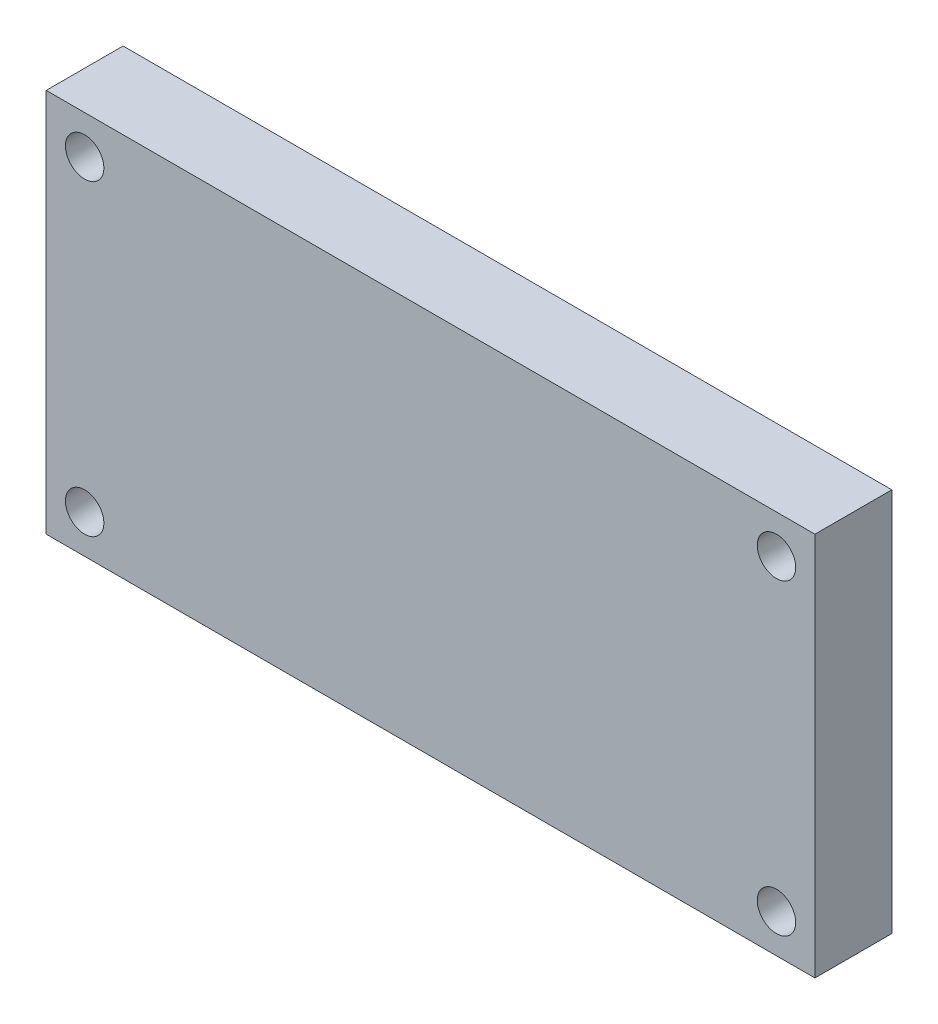
ISO-10303-21;
HEADER;
FILE_DESCRIPTION(('STEP AP214'),'2;1');
FILE_NAME('part.step','',(''),(''),'','','');
FILE_SCHEMA(('AUTOMOTIVE_DESIGN { 1 0 10303 214 1 1 1 1 }'));
ENDSEC;
DATA;
#1=APPLICATION_CONTEXT('core data for automotive mechanical design processes');
#2=APPLICATION_PROTOCOL_DEFINITION('international standard','automotive_design',2000,#1);
#3=PRODUCT_CONTEXT('',#1,'mechanical');
#4=PRODUCT('Part','Part','',(#3));
#5=PRODUCT_RELATED_PRODUCT_CATEGORY('part','',(#4));
#6=PRODUCT_DEFINITION_FORMATION('','',#4);
#7=PRODUCT_DEFINITION_CONTEXT('part definition',#1,'design');
#8=PRODUCT_DEFINITION('design','',#6,#7);
#9=PRODUCT_DEFINITION_SHAPE('','',#8);
#10=(LENGTH_UNIT() NAMED_UNIT(*) SI_UNIT(.MILLI.,.METRE.));
#11=(NAMED_UNIT(*) PLANE_ANGLE_UNIT() SI_UNIT($,.RADIAN.));
#12=(NAMED_UNIT(*) SI_UNIT($,.STERADIAN.) SOLID_ANGLE_UNIT());
#13=UNCERTAINTY_MEASURE_WITH_UNIT(LENGTH_MEASURE(1.E-05),#10,'distance_accuracy_value','');
#14=(GEOMETRIC_REPRESENTATION_CONTEXT(3) GLOBAL_UNCERTAINTY_ASSIGNED_CONTEXT((#13)) GLOBAL_UNIT_ASSIGNED_CONTEXT((#10,
#11,#12)) REPRESENTATION_CONTEXT('',''));
#15=CARTESIAN_POINT('',(0.,0.,0.));
#16=DIRECTION('',(0.,0.,1.));
#17=DIRECTION('',(1.,0.,0.));
#18=AXIS2_PLACEMENT_3D('',#15,#16,#17);
#19=CARTESIAN_POINT('',(0.,0.,-5.));
#20=DIRECTION('',(0.,0.,-1.));
#21=DIRECTION('',(-1.,0.,0.));
#22=AXIS2_PLACEMENT_3D('',#19,#20,#21);
#23=PLANE('',#22);
#24=CARTESIAN_POINT('',(5.,45.,-5.));
#25=DIRECTION('',(0.,0.,1.));
#26=DIRECTION('',(1.,0.,0.));
#27=AXIS2_PLACEMENT_3D('',#24,#25,#26);
#28=CIRCLE('',#27,2.5);
#29=CARTESIAN_POINT('',(7.5,45.,-5.));
#30=VERTEX_POINT('',#29);
#31=EDGE_CURVE('E359',#30,#30,#28,.T.);
#32=ORIENTED_EDGE('',*,*,#31,.T.);
#33=EDGE_LOOP('',(#32));
#34=FACE_BOUND('',#33,.T.);
#35=CARTESIAN_POINT('',(95.,5.,-5.));
#36=DIRECTION('',(0.,0.,1.));
#37=DIRECTION('',(1.,0.,0.));
#38=AXIS2_PLACEMENT_3D('',#35,#36,#37);
#39=CIRCLE('',#38,2.5);
#40=CARTESIAN_POINT('',(97.5,5.,-5.));
#41=VERTEX_POINT('',#40);
#42=EDGE_CURVE('E369',#41,#41,#39,.T.);
#43=ORIENTED_EDGE('',*,*,#42,.T.);
#44=EDGE_LOOP('',(#43));
#45=FACE_BOUND('',#44,.T.);
#46=DIRECTION('',(0.,1.,0.));
#47=VECTOR('',#46,1.);
#48=CARTESIAN_POINT('',(0.,0.,-5.));
#49=LINE('',#48,#47);
#50=CARTESIAN_POINT('',(0.,0.,-5.));
#51=VERTEX_POINT('',#50);
#52=CARTESIAN_POINT('',(0.,50.,-5.));
#53=VERTEX_POINT('',#52);
#54=EDGE_CURVE('E381',#51,#53,#49,.T.);
#55=ORIENTED_EDGE('',*,*,#54,.T.);
#56=DIRECTION('',(1.,0.,0.));
#57=VECTOR('',#56,1.);
#58=CARTESIAN_POINT('',(0.,50.,-5.));
#59=LINE('',#58,#57);
#60=CARTESIAN_POINT('',(100.,50.,-5.));
#61=VERTEX_POINT('',#60);
#62=EDGE_CURVE('E397',#53,#61,#59,.T.);
#63=ORIENTED_EDGE('',*,*,#62,.T.);
#64=DIRECTION('',(0.,1.,0.));
#65=VECTOR('',#64,1.);
#66=CARTESIAN_POINT('',(100.,0.,-5.));
#67=LINE('',#66,#65);
#68=CARTESIAN_POINT('',(100.,0.,-5.));
#69=VERTEX_POINT('',#68);
#70=EDGE_CURVE('E400',#69,#61,#67,.T.);
#71=ORIENTED_EDGE('',*,*,#70,.F.);
#72=DIRECTION('',(1.,0.,0.));
#73=VECTOR('',#72,1.);
#74=CARTESIAN_POINT('',(0.,0.,-5.));
#75=LINE('',#74,#73);
#76=EDGE_CURVE('E388',#51,#69,#75,.T.);
#77=ORIENTED_EDGE('',*,*,#76,.F.);
#78=EDGE_LOOP('',(#55,#63,#71,#77));
#79=FACE_BOUND('',#78,.T.);
#80=CARTESIAN_POINT('',(5.,5.,-5.));
#81=DIRECTION('',(0.,0.,1.));
#82=DIRECTION('',(1.,0.,0.));
#83=AXIS2_PLACEMENT_3D('',#80,#81,#82);
#84=CIRCLE('',#83,2.5);
#85=CARTESIAN_POINT('',(7.5,5.,-5.));
#86=VERTEX_POINT('',#85);
#87=EDGE_CURVE('E375',#86,#86,#84,.T.);
#88=ORIENTED_EDGE('',*,*,#87,.T.);
#89=EDGE_LOOP('',(#88));
#90=FACE_BOUND('',#89,.T.);
#91=CARTESIAN_POINT('',(95.,45.,-5.));
#92=DIRECTION('',(0.,0.,1.));
#93=DIRECTION('',(1.,0.,0.));
#94=AXIS2_PLACEMENT_3D('',#91,#92,#93);
#95=CIRCLE('',#94,2.5);
#96=CARTESIAN_POINT('',(97.5,45.,-5.));
#97=VERTEX_POINT('',#96);
#98=EDGE_CURVE('E363',#97,#97,#95,.T.);
#99=ORIENTED_EDGE('',*,*,#98,.T.);
#100=EDGE_LOOP('',(#99));
#101=FACE_BOUND('',#100,.T.);
#102=DIRECTION('',(-1.,0.,0.));
#103=VECTOR('',#102,1.);
#104=CARTESIAN_POINT('',(60.,20.,-5.));
#105=LINE('',#104,#103);
#106=CARTESIAN_POINT('',(60.,20.,-5.));
#107=VERTEX_POINT('',#106);
#108=CARTESIAN_POINT('',(40.,20.,-5.));
#109=VERTEX_POINT('',#108);
#110=EDGE_CURVE('E165',#107,#109,#105,.T.);
#111=ORIENTED_EDGE('',*,*,#110,.F.);
#112=DIRECTION('',(0.,-1.,0.));
#113=VECTOR('',#112,1.);
#114=CARTESIAN_POINT('',(60.,30.,-5.));
#115=LINE('',#114,#113);
#116=CARTESIAN_POINT('',(60.,30.,-5.));
#117=VERTEX_POINT('',#116);
#118=EDGE_CURVE('E331',#117,#107,#115,.T.);
#119=ORIENTED_EDGE('',*,*,#118,.F.);
#120=DIRECTION('',(-1.,0.,0.));
#121=VECTOR('',#120,1.);
#122=CARTESIAN_POINT('',(60.,30.,-5.));
#123=LINE('',#122,#121);
#124=CARTESIAN_POINT('',(40.,30.,-5.));
#125=VERTEX_POINT('',#124);
#126=EDGE_CURVE('E336',#117,#125,#123,.T.);
#127=ORIENTED_EDGE('',*,*,#126,.T.);
#128=DIRECTION('',(0.,-1.,0.));
#129=VECTOR('',#128,1.);
#130=CARTESIAN_POINT('',(40.,30.,-5.));
#131=LINE('',#130,#129);
#132=EDGE_CURVE('E170',#125,#109,#131,.T.);
#133=ORIENTED_EDGE('',*,*,#132,.T.);
#134=EDGE_LOOP('',(#111,#119,#127,#133));
#135=FACE_BOUND('',#134,.T.);
#136=ADVANCED_FACE('F148',(#34,#45,#79,#90,#101,#135),#23,.T.);
#137=CARTESIAN_POINT('',(0.,0.,5.));
#138=DIRECTION('',(0.,0.,-1.));
#139=DIRECTION('',(-1.,0.,0.));
#140=AXIS2_PLACEMENT_3D('',#137,#138,#139);
#141=PLANE('',#140);
#142=DIRECTION('',(0.,1.,0.));
#143=VECTOR('',#142,1.);
#144=CARTESIAN_POINT('',(0.,0.,5.));
#145=LINE('',#144,#143);
#146=CARTESIAN_POINT('',(0.,0.,5.));
#147=VERTEX_POINT('',#146);
#148=CARTESIAN_POINT('',(0.,50.,5.));
#149=VERTEX_POINT('',#148);
#150=EDGE_CURVE('E384',#147,#149,#145,.T.);
#151=ORIENTED_EDGE('',*,*,#150,.F.);
#152=DIRECTION('',(1.,0.,0.));
#153=VECTOR('',#152,1.);
#154=CARTESIAN_POINT('',(0.,0.,5.));
#155=LINE('',#154,#153);
#156=CARTESIAN_POINT('',(100.,0.,5.));
#157=VERTEX_POINT('',#156);
#158=EDGE_CURVE('E393',#147,#157,#155,.T.);
#159=ORIENTED_EDGE('',*,*,#158,.T.);
#160=DIRECTION('',(0.,1.,0.));
#161=VECTOR('',#160,1.);
#162=CARTESIAN_POINT('',(100.,0.,5.));
#163=LINE('',#162,#161);
#164=CARTESIAN_POINT('',(100.,50.,5.));
#165=VERTEX_POINT('',#164);
#166=EDGE_CURVE('E391',#157,#165,#163,.T.);
#167=ORIENTED_EDGE('',*,*,#166,.T.);
#168=DIRECTION('',(1.,0.,0.));
#169=VECTOR('',#168,1.);
#170=CARTESIAN_POINT('',(0.,50.,5.));
#171=LINE('',#170,#169);
#172=EDGE_CURVE('E387',#149,#165,#171,.T.);
#173=ORIENTED_EDGE('',*,*,#172,.F.);
#174=EDGE_LOOP('',(#151,#159,#167,#173));
#175=FACE_BOUND('',#174,.T.);
#176=CARTESIAN_POINT('',(5.,5.,5.));
#177=DIRECTION('',(0.,0.,1.));
#178=DIRECTION('',(1.,0.,0.));
#179=AXIS2_PLACEMENT_3D('',#176,#177,#178);
#180=CIRCLE('',#179,2.5);
#181=CARTESIAN_POINT('',(7.5,5.,5.));
#182=VERTEX_POINT('',#181);
#183=EDGE_CURVE('E378',#182,#182,#180,.T.);
#184=ORIENTED_EDGE('',*,*,#183,.F.);
#185=EDGE_LOOP('',(#184));
#186=FACE_BOUND('',#185,.T.);
#187=CARTESIAN_POINT('',(95.,5.,5.));
#188=DIRECTION('',(0.,0.,1.));
#189=DIRECTION('',(1.,0.,0.));
#190=AXIS2_PLACEMENT_3D('',#187,#188,#189);
#191=CIRCLE('',#190,2.5);
#192=CARTESIAN_POINT('',(97.5,5.,5.));
#193=VERTEX_POINT('',#192);
#194=EDGE_CURVE('E372',#193,#193,#191,.T.);
#195=ORIENTED_EDGE('',*,*,#194,.F.);
#196=EDGE_LOOP('',(#195));
#197=FACE_BOUND('',#196,.T.);
#198=CARTESIAN_POINT('',(95.,45.,5.));
#199=DIRECTION('',(0.,0.,1.));
#200=DIRECTION('',(1.,0.,0.));
#201=AXIS2_PLACEMENT_3D('',#198,#199,#200);
#202=CIRCLE('',#201,2.5);
#203=CARTESIAN_POINT('',(97.5,45.,5.));
#204=VERTEX_POINT('',#203);
#205=EDGE_CURVE('E366',#204,#204,#202,.T.);
#206=ORIENTED_EDGE('',*,*,#205,.F.);
#207=EDGE_LOOP('',(#206));
#208=FACE_BOUND('',#207,.T.);
#209=CARTESIAN_POINT('',(5.,45.,5.));
#210=DIRECTION('',(0.,0.,1.));
#211=DIRECTION('',(1.,0.,0.));
#212=AXIS2_PLACEMENT_3D('',#209,#210,#211);
#213=CIRCLE('',#212,2.5);
#214=CARTESIAN_POINT('',(7.5,45.,5.));
#215=VERTEX_POINT('',#214);
#216=EDGE_CURVE('E360',#215,#215,#213,.T.);
#217=ORIENTED_EDGE('',*,*,#216,.F.);
#218=EDGE_LOOP('',(#217));
#219=FACE_BOUND('',#218,.T.);
#220=ADVANCED_FACE('F426',(#175,#186,#197,#208,#219),#141,.F.);
#221=CARTESIAN_POINT('',(0.,0.,5.));
#222=DIRECTION('',(-1.,0.,0.));
#223=DIRECTION('',(0.,0.,1.));
#224=AXIS2_PLACEMENT_3D('',#221,#222,#223);
#225=PLANE('',#224);
#226=ORIENTED_EDGE('',*,*,#54,.F.);
#227=DIRECTION('',(0.,0.,-1.));
#228=VECTOR('',#227,1.);
#229=CARTESIAN_POINT('',(0.,0.,5.));
#230=LINE('',#229,#228);
#231=EDGE_CURVE('E12',#147,#51,#230,.T.);
#232=ORIENTED_EDGE('',*,*,#231,.F.);
#233=ORIENTED_EDGE('',*,*,#150,.T.);
#234=DIRECTION('',(0.,0.,-1.));
#235=VECTOR('',#234,1.);
#236=CARTESIAN_POINT('',(0.,50.,5.));
#237=LINE('',#236,#235);
#238=EDGE_CURVE('E152',#149,#53,#237,.T.);
#239=ORIENTED_EDGE('',*,*,#238,.T.);
#240=EDGE_LOOP('',(#226,#232,#233,#239));
#241=FACE_BOUND('',#240,.T.);
#242=ADVANCED_FACE('F150',(#241),#225,.T.);
#243=CARTESIAN_POINT('',(0.,0.,5.));
#244=DIRECTION('',(0.,1.,0.));
#245=DIRECTION('',(0.,0.,1.));
#246=AXIS2_PLACEMENT_3D('',#243,#244,#245);
#247=PLANE('',#246);
#248=ORIENTED_EDGE('',*,*,#76,.T.);
#249=DIRECTION('',(0.,0.,-1.));
#250=VECTOR('',#249,1.);
#251=CARTESIAN_POINT('',(100.,0.,5.));
#252=LINE('',#251,#250);
#253=EDGE_CURVE('E157',#157,#69,#252,.T.);
#254=ORIENTED_EDGE('',*,*,#253,.F.);
#255=ORIENTED_EDGE('',*,*,#158,.F.);
#256=ORIENTED_EDGE('',*,*,#231,.T.);
#257=EDGE_LOOP('',(#248,#254,#255,#256));
#258=FACE_BOUND('',#257,.T.);
#259=ADVANCED_FACE('F420',(#258),#247,.F.);
#260=CARTESIAN_POINT('',(100.,0.,5.));
#261=DIRECTION('',(-1.,0.,0.));
#262=DIRECTION('',(0.,0.,1.));
#263=AXIS2_PLACEMENT_3D('',#260,#261,#262);
#264=PLANE('',#263);
#265=ORIENTED_EDGE('',*,*,#70,.T.);
#266=DIRECTION('',(0.,0.,-1.));
#267=VECTOR('',#266,1.);
#268=CARTESIAN_POINT('',(100.,50.,5.));
#269=LINE('',#268,#267);
#270=EDGE_CURVE('E405',#165,#61,#269,.T.);
#271=ORIENTED_EDGE('',*,*,#270,.F.);
#272=ORIENTED_EDGE('',*,*,#166,.F.);
#273=ORIENTED_EDGE('',*,*,#253,.T.);
#274=EDGE_LOOP('',(#265,#271,#272,#273));
#275=FACE_BOUND('',#274,.T.);
#276=ADVANCED_FACE('F424',(#275),#264,.F.);
#277=CARTESIAN_POINT('',(0.,50.,5.));
#278=DIRECTION('',(0.,1.,0.));
#279=DIRECTION('',(0.,0.,1.));
#280=AXIS2_PLACEMENT_3D('',#277,#278,#279);
#281=PLANE('',#280);
#282=ORIENTED_EDGE('',*,*,#62,.F.);
#283=ORIENTED_EDGE('',*,*,#238,.F.);
#284=ORIENTED_EDGE('',*,*,#172,.T.);
#285=ORIENTED_EDGE('',*,*,#270,.T.);
#286=EDGE_LOOP('',(#282,#283,#284,#285));
#287=FACE_BOUND('',#286,.T.);
#288=ADVANCED_FACE('F413',(#287),#281,.T.);
#289=CARTESIAN_POINT('',(5.,5.,5.));
#290=DIRECTION('',(0.,0.,-1.));
#291=DIRECTION('',(-1.,0.,0.));
#292=AXIS2_PLACEMENT_3D('',#289,#290,#291);
#293=CYLINDRICAL_SURFACE('',#292,2.5);
#294=ORIENTED_EDGE('',*,*,#183,.T.);
#295=EDGE_LOOP('',(#294));
#296=FACE_BOUND('',#295,.T.);
#297=ORIENTED_EDGE('',*,*,#87,.F.);
#298=EDGE_LOOP('',(#297));
#299=FACE_BOUND('',#298,.T.);
#300=ADVANCED_FACE('F453',(#296,#299),#293,.F.);
#301=CARTESIAN_POINT('',(95.,5.,5.));
#302=DIRECTION('',(0.,0.,-1.));
#303=DIRECTION('',(-1.,0.,0.));
#304=AXIS2_PLACEMENT_3D('',#301,#302,#303);
#305=CYLINDRICAL_SURFACE('',#304,2.5);
#306=ORIENTED_EDGE('',*,*,#194,.T.);
#307=EDGE_LOOP('',(#306));
#308=FACE_BOUND('',#307,.T.);
#309=ORIENTED_EDGE('',*,*,#42,.F.);
#310=EDGE_LOOP('',(#309));
#311=FACE_BOUND('',#310,.T.);
#312=ADVANCED_FACE('F451',(#308,#311),#305,.F.);
#313=CARTESIAN_POINT('',(95.,45.,5.));
#314=DIRECTION('',(0.,0.,-1.));
#315=DIRECTION('',(-1.,0.,0.));
#316=AXIS2_PLACEMENT_3D('',#313,#314,#315);
#317=CYLINDRICAL_SURFACE('',#316,2.5);
#318=ORIENTED_EDGE('',*,*,#205,.T.);
#319=EDGE_LOOP('',(#318));
#320=FACE_BOUND('',#319,.T.);
#321=ORIENTED_EDGE('',*,*,#98,.F.);
#322=EDGE_LOOP('',(#321));
#323=FACE_BOUND('',#322,.T.);
#324=ADVANCED_FACE('F442',(#320,#323),#317,.F.);
#325=CARTESIAN_POINT('',(5.,45.,5.));
#326=DIRECTION('',(0.,0.,-1.));
#327=DIRECTION('',(-1.,0.,0.));
#328=AXIS2_PLACEMENT_3D('',#325,#326,#327);
#329=CYLINDRICAL_SURFACE('',#328,2.5);
#330=ORIENTED_EDGE('',*,*,#216,.T.);
#331=EDGE_LOOP('',(#330));
#332=FACE_BOUND('',#331,.T.);
#333=ORIENTED_EDGE('',*,*,#31,.F.);
#334=EDGE_LOOP('',(#333));
#335=FACE_BOUND('',#334,.T.);
#336=ADVANCED_FACE('F438',(#332,#335),#329,.F.);
#337=CARTESIAN_POINT('',(0.,0.,-7.));
#338=DIRECTION('',(0.,0.,-1.));
#339=DIRECTION('',(-1.,0.,0.));
#340=AXIS2_PLACEMENT_3D('',#337,#338,#339);
#341=PLANE('',#340);
#342=DIRECTION('',(0.,-1.,0.));
#343=VECTOR('',#342,1.);
#344=CARTESIAN_POINT('',(60.,30.,-7.));
#345=LINE('',#344,#343);
#346=CARTESIAN_POINT('',(60.,30.,-7.));
#347=VERTEX_POINT('',#346);
#348=CARTESIAN_POINT('',(60.,20.,-7.));
#349=VERTEX_POINT('',#348);
#350=EDGE_CURVE('E332',#347,#349,#345,.T.);
#351=ORIENTED_EDGE('',*,*,#350,.T.);
#352=DIRECTION('',(-1.,0.,0.));
#353=VECTOR('',#352,1.);
#354=CARTESIAN_POINT('',(60.,20.,-7.));
#355=LINE('',#354,#353);
#356=CARTESIAN_POINT('',(40.,20.,-7.));
#357=VERTEX_POINT('',#356);
#358=EDGE_CURVE('E335',#349,#357,#355,.T.);
#359=ORIENTED_EDGE('',*,*,#358,.T.);
#360=DIRECTION('',(0.,-1.,0.));
#361=VECTOR('',#360,1.);
#362=CARTESIAN_POINT('',(40.,30.,-7.));
#363=LINE('',#362,#361);
#364=CARTESIAN_POINT('',(40.,30.,-7.));
#365=VERTEX_POINT('',#364);
#366=EDGE_CURVE('E338',#365,#357,#363,.T.);
#367=ORIENTED_EDGE('',*,*,#366,.F.);
#368=DIRECTION('',(-1.,0.,0.));
#369=VECTOR('',#368,1.);
#370=CARTESIAN_POINT('',(60.,30.,-7.));
#371=LINE('',#370,#369);
#372=EDGE_CURVE('E341',#347,#365,#371,.T.);
#373=ORIENTED_EDGE('',*,*,#372,.F.);
#374=EDGE_LOOP('',(#351,#359,#367,#373));
#375=FACE_BOUND('',#374,.T.);
#376=DIRECTION('',(-1.,0.,0.));
#377=VECTOR('',#376,1.);
#378=CARTESIAN_POINT('',(49.5,21.,-7.));
#379=LINE('',#378,#377);
#380=CARTESIAN_POINT('',(49.5,21.,-7.));
#381=VERTEX_POINT('',#380);
#382=CARTESIAN_POINT('',(41.,21.,-7.));
#383=VERTEX_POINT('',#382);
#384=EDGE_CURVE('E322',#381,#383,#379,.T.);
#385=ORIENTED_EDGE('',*,*,#384,.F.);
#386=DIRECTION('',(0.,-1.,0.));
#387=VECTOR('',#386,1.);
#388=CARTESIAN_POINT('',(49.5,29.,-7.));
#389=LINE('',#388,#387);
#390=CARTESIAN_POINT('',(49.5,29.,-7.));
#391=VERTEX_POINT('',#390);
#392=EDGE_CURVE('E320',#391,#381,#389,.T.);
#393=ORIENTED_EDGE('',*,*,#392,.F.);
#394=DIRECTION('',(-1.,0.,0.));
#395=VECTOR('',#394,1.);
#396=CARTESIAN_POINT('',(49.5,29.,-7.));
#397=LINE('',#396,#395);
#398=CARTESIAN_POINT('',(41.,29.,-7.));
#399=VERTEX_POINT('',#398);
#400=EDGE_CURVE('E328',#391,#399,#397,.T.);
#401=ORIENTED_EDGE('',*,*,#400,.T.);
#402=DIRECTION('',(0.,-1.,0.));
#403=VECTOR('',#402,1.);
#404=CARTESIAN_POINT('',(41.,29.,-7.));
#405=LINE('',#404,#403);
#406=EDGE_CURVE('E325',#399,#383,#405,.T.);
#407=ORIENTED_EDGE('',*,*,#406,.T.);
#408=EDGE_LOOP('',(#385,#393,#401,#407));
#409=FACE_BOUND('',#408,.T.);
#410=DIRECTION('',(-1.,0.,0.));
#411=VECTOR('',#410,1.);
#412=CARTESIAN_POINT('',(59.,21.,-7.));
#413=LINE('',#412,#411);
#414=CARTESIAN_POINT('',(59.,21.,-7.));
#415=VERTEX_POINT('',#414);
#416=CARTESIAN_POINT('',(50.5,21.,-7.));
#417=VERTEX_POINT('',#416);
#418=EDGE_CURVE('E313',#415,#417,#413,.T.);
#419=ORIENTED_EDGE('',*,*,#418,.F.);
#420=DIRECTION('',(0.,-1.,0.));
#421=VECTOR('',#420,1.);
#422=CARTESIAN_POINT('',(59.,29.,-7.));
#423=LINE('',#422,#421);
#424=CARTESIAN_POINT('',(59.,29.,-7.));
#425=VERTEX_POINT('',#424);
#426=EDGE_CURVE('E304',#425,#415,#423,.T.);
#427=ORIENTED_EDGE('',*,*,#426,.F.);
#428=DIRECTION('',(-1.,0.,0.));
#429=VECTOR('',#428,1.);
#430=CARTESIAN_POINT('',(59.,29.,-7.));
#431=LINE('',#430,#429);
#432=CARTESIAN_POINT('',(50.5,29.,-7.));
#433=VERTEX_POINT('',#432);
#434=EDGE_CURVE('E268',#425,#433,#431,.T.);
#435=ORIENTED_EDGE('',*,*,#434,.T.);
#436=DIRECTION('',(0.,-1.,0.));
#437=VECTOR('',#436,1.);
#438=CARTESIAN_POINT('',(50.5,29.,-7.));
#439=LINE('',#438,#437);
#440=EDGE_CURVE('E316',#433,#417,#439,.T.);
#441=ORIENTED_EDGE('',*,*,#440,.T.);
#442=EDGE_LOOP('',(#419,#427,#435,#441));
#443=FACE_BOUND('',#442,.T.);
#444=ADVANCED_FACE('F441',(#375,#409,#443),#341,.T.);
#445=CARTESIAN_POINT('',(60.,30.,-7.));
#446=DIRECTION('',(-1.,0.,0.));
#447=DIRECTION('',(0.,0.,1.));
#448=AXIS2_PLACEMENT_3D('',#445,#446,#447);
#449=PLANE('',#448);
#450=ORIENTED_EDGE('',*,*,#118,.T.);
#451=DIRECTION('',(0.,0.,1.));
#452=VECTOR('',#451,1.);
#453=CARTESIAN_POINT('',(60.,20.,-7.));
#454=LINE('',#453,#452);
#455=EDGE_CURVE('E357',#349,#107,#454,.T.);
#456=ORIENTED_EDGE('',*,*,#455,.F.);
#457=ORIENTED_EDGE('',*,*,#350,.F.);
#458=DIRECTION('',(0.,0.,1.));
#459=VECTOR('',#458,1.);
#460=CARTESIAN_POINT('',(60.,30.,-7.));
#461=LINE('',#460,#459);
#462=EDGE_CURVE('E344',#347,#117,#461,.T.);
#463=ORIENTED_EDGE('',*,*,#462,.T.);
#464=EDGE_LOOP('',(#450,#456,#457,#463));
#465=FACE_BOUND('',#464,.T.);
#466=ADVANCED_FACE('F506',(#465),#449,.F.);
#467=CARTESIAN_POINT('',(60.,20.,-7.));
#468=DIRECTION('',(0.,1.,0.));
#469=DIRECTION('',(0.,0.,1.));
#470=AXIS2_PLACEMENT_3D('',#467,#468,#469);
#471=PLANE('',#470);
#472=ORIENTED_EDGE('',*,*,#110,.T.);
#473=DIRECTION('',(0.,0.,1.));
#474=VECTOR('',#473,1.);
#475=CARTESIAN_POINT('',(40.,20.,-7.));
#476=LINE('',#475,#474);
#477=EDGE_CURVE('E355',#357,#109,#476,.T.);
#478=ORIENTED_EDGE('',*,*,#477,.F.);
#479=ORIENTED_EDGE('',*,*,#358,.F.);
#480=ORIENTED_EDGE('',*,*,#455,.T.);
#481=EDGE_LOOP('',(#472,#478,#479,#480));
#482=FACE_BOUND('',#481,.T.);
#483=ADVANCED_FACE('F511',(#482),#471,.F.);
#484=CARTESIAN_POINT('',(40.,30.,-7.));
#485=DIRECTION('',(-1.,0.,0.));
#486=DIRECTION('',(0.,-1.,0.));
#487=AXIS2_PLACEMENT_3D('',#484,#485,#486);
#488=PLANE('',#487);
#489=ORIENTED_EDGE('',*,*,#132,.F.);
#490=DIRECTION('',(0.,0.,1.));
#491=VECTOR('',#490,1.);
#492=CARTESIAN_POINT('',(40.,30.,-7.));
#493=LINE('',#492,#491);
#494=EDGE_CURVE('E352',#365,#125,#493,.T.);
#495=ORIENTED_EDGE('',*,*,#494,.F.);
#496=ORIENTED_EDGE('',*,*,#366,.T.);
#497=ORIENTED_EDGE('',*,*,#477,.T.);
#498=EDGE_LOOP('',(#489,#495,#496,#497));
#499=FACE_BOUND('',#498,.T.);
#500=ADVANCED_FACE('F521',(#499),#488,.T.);
#501=CARTESIAN_POINT('',(60.,30.,-7.));
#502=DIRECTION('',(0.,1.,0.));
#503=DIRECTION('',(0.,0.,1.));
#504=AXIS2_PLACEMENT_3D('',#501,#502,#503);
#505=PLANE('',#504);
#506=ORIENTED_EDGE('',*,*,#126,.F.);
#507=ORIENTED_EDGE('',*,*,#462,.F.);
#508=ORIENTED_EDGE('',*,*,#372,.T.);
#509=ORIENTED_EDGE('',*,*,#494,.T.);
#510=EDGE_LOOP('',(#506,#507,#508,#509));
#511=FACE_BOUND('',#510,.T.);
#512=ADVANCED_FACE('F531',(#511),#505,.T.);
#513=CARTESIAN_POINT('',(49.5,29.,-8.));
#514=DIRECTION('',(0.,1.,0.));
#515=DIRECTION('',(0.,0.,1.));
#516=AXIS2_PLACEMENT_3D('',#513,#514,#515);
#517=PLANE('',#516);
#518=DIRECTION('',(0.,0.,1.));
#519=VECTOR('',#518,1.);
#520=CARTESIAN_POINT('',(41.,29.,-8.));
#521=LINE('',#520,#519);
#522=CARTESIAN_POINT('',(41.,29.,-8.));
#523=VERTEX_POINT('',#522);
#524=EDGE_CURVE('E300',#523,#399,#521,.T.);
#525=ORIENTED_EDGE('',*,*,#524,.T.);
#526=ORIENTED_EDGE('',*,*,#400,.F.);
#527=DIRECTION('',(0.,0.,1.));
#528=VECTOR('',#527,1.);
#529=CARTESIAN_POINT('',(49.5,29.,-8.));
#530=LINE('',#529,#528);
#531=CARTESIAN_POINT('',(49.5,29.,-8.));
#532=VERTEX_POINT('',#531);
#533=EDGE_CURVE('E301',#532,#391,#530,.T.);
#534=ORIENTED_EDGE('',*,*,#533,.F.);
#535=DIRECTION('',(-1.,0.,0.));
#536=VECTOR('',#535,1.);
#537=CARTESIAN_POINT('',(49.5,29.,-8.));
#538=LINE('',#537,#536);
#539=EDGE_CURVE('E286',#532,#523,#538,.T.);
#540=ORIENTED_EDGE('',*,*,#539,.T.);
#541=EDGE_LOOP('',(#525,#526,#534,#540));
#542=FACE_BOUND('',#541,.T.);
#543=ADVANCED_FACE('F541',(#542),#517,.T.);
#544=CARTESIAN_POINT('',(49.5,29.,-8.));
#545=DIRECTION('',(-1.,0.,0.));
#546=DIRECTION('',(0.,0.,1.));
#547=AXIS2_PLACEMENT_3D('',#544,#545,#546);
#548=PLANE('',#547);
#549=ORIENTED_EDGE('',*,*,#392,.T.);
#550=DIRECTION('',(0.,0.,1.));
#551=VECTOR('',#550,1.);
#552=CARTESIAN_POINT('',(49.5,21.,-8.));
#553=LINE('',#552,#551);
#554=CARTESIAN_POINT('',(49.5,21.,-8.));
#555=VERTEX_POINT('',#554);
#556=EDGE_CURVE('E305',#555,#381,#553,.T.);
#557=ORIENTED_EDGE('',*,*,#556,.F.);
#558=DIRECTION('',(0.,-1.,0.));
#559=VECTOR('',#558,1.);
#560=CARTESIAN_POINT('',(49.5,29.,-8.));
#561=LINE('',#560,#559);
#562=EDGE_CURVE('E298',#532,#555,#561,.T.);
#563=ORIENTED_EDGE('',*,*,#562,.F.);
#564=ORIENTED_EDGE('',*,*,#533,.T.);
#565=EDGE_LOOP('',(#549,#557,#563,#564));
#566=FACE_BOUND('',#565,.T.);
#567=ADVANCED_FACE('F559',(#566),#548,.F.);
#568=CARTESIAN_POINT('',(49.5,21.,-8.));
#569=DIRECTION('',(0.,1.,0.));
#570=DIRECTION('',(0.,0.,1.));
#571=AXIS2_PLACEMENT_3D('',#568,#569,#570);
#572=PLANE('',#571);
#573=ORIENTED_EDGE('',*,*,#384,.T.);
#574=DIRECTION('',(0.,0.,1.));
#575=VECTOR('',#574,1.);
#576=CARTESIAN_POINT('',(41.,21.,-8.));
#577=LINE('',#576,#575);
#578=CARTESIAN_POINT('',(41.,21.,-8.));
#579=VERTEX_POINT('',#578);
#580=EDGE_CURVE('E308',#579,#383,#577,.T.);
#581=ORIENTED_EDGE('',*,*,#580,.F.);
#582=DIRECTION('',(-1.,0.,0.));
#583=VECTOR('',#582,1.);
#584=CARTESIAN_POINT('',(49.5,21.,-8.));
#585=LINE('',#584,#583);
#586=EDGE_CURVE('E296',#555,#579,#585,.T.);
#587=ORIENTED_EDGE('',*,*,#586,.F.);
#588=ORIENTED_EDGE('',*,*,#556,.T.);
#589=EDGE_LOOP('',(#573,#581,#587,#588));
#590=FACE_BOUND('',#589,.T.);
#591=ADVANCED_FACE('F572',(#590),#572,.F.);
#592=CARTESIAN_POINT('',(41.,29.,-8.));
#593=DIRECTION('',(-1.,0.,0.));
#594=DIRECTION('',(0.,0.,1.));
#595=AXIS2_PLACEMENT_3D('',#592,#593,#594);
#596=PLANE('',#595);
#597=ORIENTED_EDGE('',*,*,#580,.T.);
#598=ORIENTED_EDGE('',*,*,#406,.F.);
#599=ORIENTED_EDGE('',*,*,#524,.F.);
#600=DIRECTION('',(0.,-1.,0.));
#601=VECTOR('',#600,1.);
#602=CARTESIAN_POINT('',(41.,29.,-8.));
#603=LINE('',#602,#601);
#604=EDGE_CURVE('E289',#523,#579,#603,.T.);
#605=ORIENTED_EDGE('',*,*,#604,.T.);
#606=EDGE_LOOP('',(#597,#598,#599,#605));
#607=FACE_BOUND('',#606,.T.);
#608=ADVANCED_FACE('F585',(#607),#596,.T.);
#609=CARTESIAN_POINT('',(0.,0.,-8.));
#610=DIRECTION('',(0.,0.,1.));
#611=DIRECTION('',(1.,0.,0.));
#612=AXIS2_PLACEMENT_3D('',#609,#610,#611);
#613=PLANE('',#612);
#614=ORIENTED_EDGE('',*,*,#539,.F.);
#615=ORIENTED_EDGE('',*,*,#562,.T.);
#616=ORIENTED_EDGE('',*,*,#586,.T.);
#617=ORIENTED_EDGE('',*,*,#604,.F.);
#618=EDGE_LOOP('',(#614,#615,#616,#617));
#619=FACE_BOUND('',#618,.T.);
#620=ADVANCED_FACE('F596',(#619),#613,.F.);
#621=CARTESIAN_POINT('',(59.,29.,-8.));
#622=DIRECTION('',(0.,1.,0.));
#623=DIRECTION('',(0.,0.,1.));
#624=AXIS2_PLACEMENT_3D('',#621,#622,#623);
#625=PLANE('',#624);
#626=DIRECTION('',(0.,0.,1.));
#627=VECTOR('',#626,1.);
#628=CARTESIAN_POINT('',(50.5,29.,-8.));
#629=LINE('',#628,#627);
#630=CARTESIAN_POINT('',(50.5,29.,-8.));
#631=VERTEX_POINT('',#630);
#632=EDGE_CURVE('E280',#631,#433,#629,.T.);
#633=ORIENTED_EDGE('',*,*,#632,.T.);
#634=ORIENTED_EDGE('',*,*,#434,.F.);
#635=DIRECTION('',(0.,0.,1.));
#636=VECTOR('',#635,1.);
#637=CARTESIAN_POINT('',(59.,29.,-8.));
#638=LINE('',#637,#636);
#639=CARTESIAN_POINT('',(59.,29.,-8.));
#640=VERTEX_POINT('',#639);
#641=EDGE_CURVE('E261',#640,#425,#638,.T.);
#642=ORIENTED_EDGE('',*,*,#641,.F.);
#643=DIRECTION('',(-1.,0.,0.));
#644=VECTOR('',#643,1.);
#645=CARTESIAN_POINT('',(59.,29.,-8.));
#646=LINE('',#645,#644);
#647=EDGE_CURVE('E266',#640,#631,#646,.T.);
#648=ORIENTED_EDGE('',*,*,#647,.T.);
#649=EDGE_LOOP('',(#633,#634,#642,#648));
#650=FACE_BOUND('',#649,.T.);
#651=ADVANCED_FACE('F264',(#650),#625,.T.);
#652=CARTESIAN_POINT('',(59.,29.,-8.));
#653=DIRECTION('',(-1.,0.,0.));
#654=DIRECTION('',(0.,0.,1.));
#655=AXIS2_PLACEMENT_3D('',#652,#653,#654);
#656=PLANE('',#655);
#657=ORIENTED_EDGE('',*,*,#426,.T.);
#658=DIRECTION('',(0.,0.,1.));
#659=VECTOR('',#658,1.);
#660=CARTESIAN_POINT('',(59.,21.,-8.));
#661=LINE('',#660,#659);
#662=CARTESIAN_POINT('',(59.,21.,-8.));
#663=VERTEX_POINT('',#662);
#664=EDGE_CURVE('E271',#663,#415,#661,.T.);
#665=ORIENTED_EDGE('',*,*,#664,.F.);
#666=DIRECTION('',(0.,-1.,0.));
#667=VECTOR('',#666,1.);
#668=CARTESIAN_POINT('',(59.,29.,-8.));
#669=LINE('',#668,#667);
#670=EDGE_CURVE('E274',#640,#663,#669,.T.);
#671=ORIENTED_EDGE('',*,*,#670,.F.);
#672=ORIENTED_EDGE('',*,*,#641,.T.);
#673=EDGE_LOOP('',(#657,#665,#671,#672));
#674=FACE_BOUND('',#673,.T.);
#675=ADVANCED_FACE('F275',(#674),#656,.F.);
#676=CARTESIAN_POINT('',(59.,21.,-8.));
#677=DIRECTION('',(0.,1.,0.));
#678=DIRECTION('',(0.,0.,1.));
#679=AXIS2_PLACEMENT_3D('',#676,#677,#678);
#680=PLANE('',#679);
#681=ORIENTED_EDGE('',*,*,#418,.T.);
#682=DIRECTION('',(0.,0.,1.));
#683=VECTOR('',#682,1.);
#684=CARTESIAN_POINT('',(50.5,21.,-8.));
#685=LINE('',#684,#683);
#686=CARTESIAN_POINT('',(50.5,21.,-8.));
#687=VERTEX_POINT('',#686);
#688=EDGE_CURVE('E667',#687,#417,#685,.T.);
#689=ORIENTED_EDGE('',*,*,#688,.F.);
#690=DIRECTION('',(-1.,0.,0.));
#691=VECTOR('',#690,1.);
#692=CARTESIAN_POINT('',(59.,21.,-8.));
#693=LINE('',#692,#691);
#694=EDGE_CURVE('E279',#663,#687,#693,.T.);
#695=ORIENTED_EDGE('',*,*,#694,.F.);
#696=ORIENTED_EDGE('',*,*,#664,.T.);
#697=EDGE_LOOP('',(#681,#689,#695,#696));
#698=FACE_BOUND('',#697,.T.);
#699=ADVANCED_FACE('F625',(#698),#680,.F.);
#700=CARTESIAN_POINT('',(50.5,29.,-8.));
#701=DIRECTION('',(-1.,0.,0.));
#702=DIRECTION('',(0.,-1.,0.));
#703=AXIS2_PLACEMENT_3D('',#700,#701,#702);
#704=PLANE('',#703);
#705=ORIENTED_EDGE('',*,*,#688,.T.);
#706=ORIENTED_EDGE('',*,*,#440,.F.);
#707=ORIENTED_EDGE('',*,*,#632,.F.);
#708=DIRECTION('',(0.,-1.,0.));
#709=VECTOR('',#708,1.);
#710=CARTESIAN_POINT('',(50.5,29.,-8.));
#711=LINE('',#710,#709);
#712=EDGE_CURVE('E285',#631,#687,#711,.T.);
#713=ORIENTED_EDGE('',*,*,#712,.T.);
#714=EDGE_LOOP('',(#705,#706,#707,#713));
#715=FACE_BOUND('',#714,.T.);
#716=ADVANCED_FACE('F634',(#715),#704,.T.);
#717=CARTESIAN_POINT('',(0.,0.,-8.));
#718=DIRECTION('',(0.,0.,1.));
#719=DIRECTION('',(1.,0.,0.));
#720=AXIS2_PLACEMENT_3D('',#717,#718,#719);
#721=PLANE('',#720);
#722=ORIENTED_EDGE('',*,*,#647,.F.);
#723=ORIENTED_EDGE('',*,*,#670,.T.);
#724=ORIENTED_EDGE('',*,*,#694,.T.);
#725=ORIENTED_EDGE('',*,*,#712,.F.);
#726=EDGE_LOOP('',(#722,#723,#724,#725));
#727=FACE_BOUND('',#726,.T.);
#728=ADVANCED_FACE('F283',(#727),#721,.F.);
#729=CLOSED_SHELL('',(#136,#220,#242,#259,#276,#288,#300,#312,#324,#336,#444,#466,#483,#500,
#512,#543,#567,#591,#608,#620,#651,#675,#699,#716,#728));
#730=MANIFOLD_SOLID_BREP('B2',#729);
#731=ADVANCED_BREP_SHAPE_REPRESENTATION('',(#18,#730),#14);
#732=SHAPE_DEFINITION_REPRESENTATION(#9,#731);
ENDSEC;
END-ISO-10303-21;
